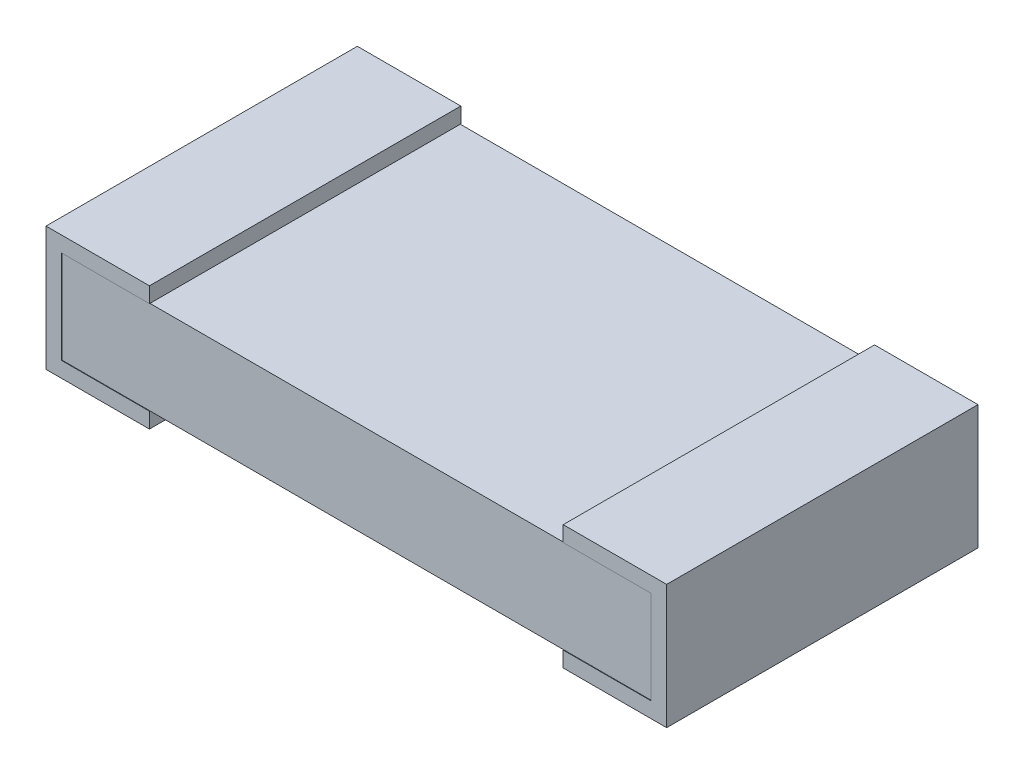
ISO-10303-21;
HEADER;
FILE_DESCRIPTION(('STEP AP214'),'2;1');
FILE_NAME('part.step','',(''),(''),'','','');
FILE_SCHEMA(('AUTOMOTIVE_DESIGN { 1 0 10303 214 1 1 1 1 }'));
ENDSEC;
DATA;
#1=APPLICATION_CONTEXT('core data for automotive mechanical design processes');
#2=APPLICATION_PROTOCOL_DEFINITION('international standard','automotive_design',2000,#1);
#3=PRODUCT_CONTEXT('',#1,'mechanical');
#4=PRODUCT('Part','Part','',(#3));
#5=PRODUCT_RELATED_PRODUCT_CATEGORY('part','',(#4));
#6=PRODUCT_DEFINITION_FORMATION('','',#4);
#7=PRODUCT_DEFINITION_CONTEXT('part definition',#1,'design');
#8=PRODUCT_DEFINITION('design','',#6,#7);
#9=PRODUCT_DEFINITION_SHAPE('','',#8);
#10=(LENGTH_UNIT() NAMED_UNIT(*) SI_UNIT(.MILLI.,.METRE.));
#11=(NAMED_UNIT(*) PLANE_ANGLE_UNIT() SI_UNIT($,.RADIAN.));
#12=(NAMED_UNIT(*) SI_UNIT($,.STERADIAN.) SOLID_ANGLE_UNIT());
#13=UNCERTAINTY_MEASURE_WITH_UNIT(LENGTH_MEASURE(1.E-05),#10,'distance_accuracy_value','');
#14=(GEOMETRIC_REPRESENTATION_CONTEXT(3) GLOBAL_UNCERTAINTY_ASSIGNED_CONTEXT((#13)) GLOBAL_UNIT_ASSIGNED_CONTEXT((#10,
#11,#12)) REPRESENTATION_CONTEXT('',''));
#15=CARTESIAN_POINT('',(0.,0.,0.));
#16=DIRECTION('',(0.,0.,1.));
#17=DIRECTION('',(1.,0.,0.));
#18=AXIS2_PLACEMENT_3D('',#15,#16,#17);
#19=CARTESIAN_POINT('',(2.9718,0.0762000000000004,-0.762));
#20=DIRECTION('',(0.,-1.,0.));
#21=DIRECTION('',(1.,0.,0.));
#22=AXIS2_PLACEMENT_3D('',#19,#20,#21);
#23=PLANE('',#22);
#24=DIRECTION('',(1.,0.,0.));
#25=VECTOR('',#24,1.);
#26=CARTESIAN_POINT('',(2.9718,0.0762000000000004,-0.762));
#27=LINE('',#26,#25);
#28=CARTESIAN_POINT('',(0.508,0.0762000000000001,-0.762));
#29=VERTEX_POINT('',#28);
#30=CARTESIAN_POINT('',(2.54,0.0762000000000001,-0.762));
#31=VERTEX_POINT('',#30);
#32=EDGE_CURVE('E41',#29,#31,#27,.T.);
#33=ORIENTED_EDGE('',*,*,#32,.T.);
#34=DIRECTION('',(0.,0.,-1.));
#35=VECTOR('',#34,1.);
#36=CARTESIAN_POINT('',(2.54,0.0762000000000001,0.76454));
#37=LINE('',#36,#35);
#38=CARTESIAN_POINT('',(2.54,0.0762000000000001,0.762));
#39=VERTEX_POINT('',#38);
#40=EDGE_CURVE('E272',#39,#31,#37,.T.);
#41=ORIENTED_EDGE('',*,*,#40,.F.);
#42=DIRECTION('',(1.,0.,0.));
#43=VECTOR('',#42,1.);
#44=CARTESIAN_POINT('',(2.9718,0.0762000000000004,0.762));
#45=LINE('',#44,#43);
#46=CARTESIAN_POINT('',(0.508,0.0762000000000001,0.762));
#47=VERTEX_POINT('',#46);
#48=EDGE_CURVE('E371',#47,#39,#45,.T.);
#49=ORIENTED_EDGE('',*,*,#48,.F.);
#50=DIRECTION('',(0.,0.,-1.));
#51=VECTOR('',#50,1.);
#52=CARTESIAN_POINT('',(0.508,0.0762000000000001,0.76454));
#53=LINE('',#52,#51);
#54=EDGE_CURVE('E333',#47,#29,#53,.T.);
#55=ORIENTED_EDGE('',*,*,#54,.T.);
#56=EDGE_LOOP('',(#33,#41,#49,#55));
#57=FACE_BOUND('',#56,.T.);
#58=ADVANCED_FACE('F32',(#57),#23,.T.);
#59=CARTESIAN_POINT('',(0.0762,0.5334,-0.762));
#60=DIRECTION('',(0.,1.,0.));
#61=DIRECTION('',(0.,0.,1.));
#62=AXIS2_PLACEMENT_3D('',#59,#60,#61);
#63=PLANE('',#62);
#64=DIRECTION('',(-1.,0.,0.));
#65=VECTOR('',#64,1.);
#66=CARTESIAN_POINT('',(0.0762,0.5334,0.762));
#67=LINE('',#66,#65);
#68=CARTESIAN_POINT('',(2.54,0.5334,0.762));
#69=VERTEX_POINT('',#68);
#70=CARTESIAN_POINT('',(0.508,0.5334,0.762));
#71=VERTEX_POINT('',#70);
#72=EDGE_CURVE('E364',#69,#71,#67,.T.);
#73=ORIENTED_EDGE('',*,*,#72,.F.);
#74=DIRECTION('',(0.,0.,-1.));
#75=VECTOR('',#74,1.);
#76=CARTESIAN_POINT('',(2.54,0.5334,0.76454));
#77=LINE('',#76,#75);
#78=CARTESIAN_POINT('',(2.54,0.5334,-0.762));
#79=VERTEX_POINT('',#78);
#80=EDGE_CURVE('E261',#69,#79,#77,.T.);
#81=ORIENTED_EDGE('',*,*,#80,.T.);
#82=DIRECTION('',(-1.,0.,0.));
#83=VECTOR('',#82,1.);
#84=CARTESIAN_POINT('',(0.0762,0.5334,-0.762));
#85=LINE('',#84,#83);
#86=CARTESIAN_POINT('',(0.508,0.5334,-0.762));
#87=VERTEX_POINT('',#86);
#88=EDGE_CURVE('E353',#79,#87,#85,.T.);
#89=ORIENTED_EDGE('',*,*,#88,.T.);
#90=DIRECTION('',(0.,0.,-1.));
#91=VECTOR('',#90,1.);
#92=CARTESIAN_POINT('',(0.508,0.5334,0.76454));
#93=LINE('',#92,#91);
#94=EDGE_CURVE('E344',#71,#87,#93,.T.);
#95=ORIENTED_EDGE('',*,*,#94,.F.);
#96=EDGE_LOOP('',(#73,#81,#89,#95));
#97=FACE_BOUND('',#96,.T.);
#98=ADVANCED_FACE('F34',(#97),#63,.T.);
#99=CARTESIAN_POINT('',(2.9718,0.5334,-0.762));
#100=DIRECTION('',(0.,0.,-1.));
#101=DIRECTION('',(-1.,0.,0.));
#102=AXIS2_PLACEMENT_3D('',#99,#100,#101);
#103=PLANE('',#102);
#104=DIRECTION('',(0.,1.,0.));
#105=VECTOR('',#104,1.);
#106=CARTESIAN_POINT('',(2.9718,0.0762000000000004,-0.762));
#107=LINE('',#106,#105);
#108=CARTESIAN_POINT('',(2.9718,0.0762,-0.762));
#109=VERTEX_POINT('',#108);
#110=CARTESIAN_POINT('',(2.9718,0.5334,-0.762));
#111=VERTEX_POINT('',#110);
#112=EDGE_CURVE('E351',#109,#111,#107,.T.);
#113=ORIENTED_EDGE('',*,*,#112,.F.);
#114=DIRECTION('',(-1.,0.,0.));
#115=VECTOR('',#114,1.);
#116=CARTESIAN_POINT('',(2.9718,0.0762,-0.762));
#117=LINE('',#116,#115);
#118=EDGE_CURVE('E254',#109,#31,#117,.T.);
#119=ORIENTED_EDGE('',*,*,#118,.T.);
#120=ORIENTED_EDGE('',*,*,#32,.F.);
#121=CARTESIAN_POINT('',(0.0762,0.0762,-0.762));
#122=VERTEX_POINT('',#121);
#123=EDGE_CURVE('E11',#122,#29,#27,.T.);
#124=ORIENTED_EDGE('',*,*,#123,.F.);
#125=DIRECTION('',(0.,-1.,0.));
#126=VECTOR('',#125,1.);
#127=CARTESIAN_POINT('',(0.0762,0.5334,-0.762));
#128=LINE('',#127,#126);
#129=CARTESIAN_POINT('',(0.0762,0.5334,-0.762));
#130=VERTEX_POINT('',#129);
#131=EDGE_CURVE('E356',#130,#122,#128,.T.);
#132=ORIENTED_EDGE('',*,*,#131,.F.);
#133=DIRECTION('',(-1.,0.,0.));
#134=VECTOR('',#133,1.);
#135=CARTESIAN_POINT('',(2.9718,0.5334,-0.762));
#136=LINE('',#135,#134);
#137=EDGE_CURVE('E327',#87,#130,#136,.T.);
#138=ORIENTED_EDGE('',*,*,#137,.F.);
#139=ORIENTED_EDGE('',*,*,#88,.F.);
#140=EDGE_CURVE('E354',#111,#79,#85,.T.);
#141=ORIENTED_EDGE('',*,*,#140,.F.);
#142=EDGE_LOOP('',(#113,#119,#120,#124,#132,#138,#139,#141));
#143=FACE_BOUND('',#142,.T.);
#144=ADVANCED_FACE('F435',(#143),#103,.T.);
#145=CARTESIAN_POINT('',(2.9718,0.5334,0.762));
#146=DIRECTION('',(0.,0.,-1.));
#147=DIRECTION('',(-1.,0.,0.));
#148=AXIS2_PLACEMENT_3D('',#145,#146,#147);
#149=PLANE('',#148);
#150=DIRECTION('',(0.,1.,0.));
#151=VECTOR('',#150,1.);
#152=CARTESIAN_POINT('',(2.9718,0.0762000000000004,0.762));
#153=LINE('',#152,#151);
#154=CARTESIAN_POINT('',(2.9718,0.0762000000000004,0.762));
#155=VERTEX_POINT('',#154);
#156=CARTESIAN_POINT('',(2.9718,0.5334,0.762));
#157=VERTEX_POINT('',#156);
#158=EDGE_CURVE('E350',#155,#157,#153,.T.);
#159=ORIENTED_EDGE('',*,*,#158,.T.);
#160=EDGE_CURVE('E361',#157,#69,#67,.T.);
#161=ORIENTED_EDGE('',*,*,#160,.T.);
#162=ORIENTED_EDGE('',*,*,#72,.T.);
#163=CARTESIAN_POINT('',(0.0762,0.5334,0.762));
#164=VERTEX_POINT('',#163);
#165=EDGE_CURVE('E360',#71,#164,#67,.T.);
#166=ORIENTED_EDGE('',*,*,#165,.T.);
#167=DIRECTION('',(0.,-1.,0.));
#168=VECTOR('',#167,1.);
#169=CARTESIAN_POINT('',(0.0762,0.5334,0.762));
#170=LINE('',#169,#168);
#171=CARTESIAN_POINT('',(0.0762,0.0762,0.762));
#172=VERTEX_POINT('',#171);
#173=EDGE_CURVE('E363',#164,#172,#170,.T.);
#174=ORIENTED_EDGE('',*,*,#173,.T.);
#175=EDGE_CURVE('E36',#172,#47,#45,.T.);
#176=ORIENTED_EDGE('',*,*,#175,.T.);
#177=ORIENTED_EDGE('',*,*,#48,.T.);
#178=EDGE_CURVE('E366',#39,#155,#45,.T.);
#179=ORIENTED_EDGE('',*,*,#178,.T.);
#180=EDGE_LOOP('',(#159,#161,#162,#166,#174,#176,#177,#179));
#181=FACE_BOUND('',#180,.T.);
#182=ADVANCED_FACE('F373',(#181),#149,.F.);
#183=CARTESIAN_POINT('',(0.0762,0.0762,0.76454));
#184=DIRECTION('',(0.,1.,0.));
#185=DIRECTION('',(-1.,0.,0.));
#186=AXIS2_PLACEMENT_3D('',#183,#184,#185);
#187=PLANE('',#186);
#188=ORIENTED_EDGE('',*,*,#175,.F.);
#189=DIRECTION('',(0.,0.,-1.));
#190=VECTOR('',#189,1.);
#191=CARTESIAN_POINT('',(0.0762,0.0762,0.76454));
#192=LINE('',#191,#190);
#193=CARTESIAN_POINT('',(0.0762,0.0762,0.76454));
#194=VERTEX_POINT('',#193);
#195=EDGE_CURVE('E335',#194,#172,#192,.T.);
#196=ORIENTED_EDGE('',*,*,#195,.F.);
#197=DIRECTION('',(1.,0.,0.));
#198=VECTOR('',#197,1.);
#199=CARTESIAN_POINT('',(0.0762,0.0762,0.76454));
#200=LINE('',#199,#198);
#201=CARTESIAN_POINT('',(0.508,0.0762000000000001,0.76454));
#202=VERTEX_POINT('',#201);
#203=EDGE_CURVE('E293',#194,#202,#200,.T.);
#204=ORIENTED_EDGE('',*,*,#203,.T.);
#205=EDGE_CURVE('E330',#202,#47,#53,.T.);
#206=ORIENTED_EDGE('',*,*,#205,.T.);
#207=EDGE_LOOP('',(#188,#196,#204,#206));
#208=FACE_BOUND('',#207,.T.);
#209=ADVANCED_FACE('F376',(#208),#187,.T.);
#210=CARTESIAN_POINT('',(0.0762,0.5334,0.76454));
#211=DIRECTION('',(1.,0.,0.));
#212=DIRECTION('',(0.,0.,-1.));
#213=AXIS2_PLACEMENT_3D('',#210,#211,#212);
#214=PLANE('',#213);
#215=ORIENTED_EDGE('',*,*,#173,.F.);
#216=DIRECTION('',(0.,0.,-1.));
#217=VECTOR('',#216,1.);
#218=CARTESIAN_POINT('',(0.0762,0.5334,0.76454));
#219=LINE('',#218,#217);
#220=CARTESIAN_POINT('',(0.0762,0.5334,0.76454));
#221=VERTEX_POINT('',#220);
#222=EDGE_CURVE('E57',#221,#164,#219,.T.);
#223=ORIENTED_EDGE('',*,*,#222,.F.);
#224=DIRECTION('',(0.,-1.,0.));
#225=VECTOR('',#224,1.);
#226=CARTESIAN_POINT('',(0.0762,0.5334,0.76454));
#227=LINE('',#226,#225);
#228=EDGE_CURVE('E290',#221,#194,#227,.T.);
#229=ORIENTED_EDGE('',*,*,#228,.T.);
#230=ORIENTED_EDGE('',*,*,#195,.T.);
#231=EDGE_LOOP('',(#215,#223,#229,#230));
#232=FACE_BOUND('',#231,.T.);
#233=ADVANCED_FACE('F379',(#232),#214,.T.);
#234=CARTESIAN_POINT('',(0.508,0.5334,0.76454));
#235=DIRECTION('',(0.,-1.,0.));
#236=DIRECTION('',(0.,0.,-1.));
#237=AXIS2_PLACEMENT_3D('',#234,#235,#236);
#238=PLANE('',#237);
#239=ORIENTED_EDGE('',*,*,#165,.F.);
#240=CARTESIAN_POINT('',(0.508,0.5334,0.76454));
#241=VERTEX_POINT('',#240);
#242=EDGE_CURVE('E341',#241,#71,#93,.T.);
#243=ORIENTED_EDGE('',*,*,#242,.F.);
#244=DIRECTION('',(-1.,0.,0.));
#245=VECTOR('',#244,1.);
#246=CARTESIAN_POINT('',(0.508,0.5334,0.76454));
#247=LINE('',#246,#245);
#248=EDGE_CURVE('E288',#241,#221,#247,.T.);
#249=ORIENTED_EDGE('',*,*,#248,.T.);
#250=ORIENTED_EDGE('',*,*,#222,.T.);
#251=EDGE_LOOP('',(#239,#243,#249,#250));
#252=FACE_BOUND('',#251,.T.);
#253=ADVANCED_FACE('F387',(#252),#238,.T.);
#254=CARTESIAN_POINT('',(0.,0.,0.76454));
#255=DIRECTION('',(-1.,0.,0.));
#256=DIRECTION('',(0.,0.,1.));
#257=AXIS2_PLACEMENT_3D('',#254,#255,#256);
#258=PLANE('',#257);
#259=DIRECTION('',(0.,1.,0.));
#260=VECTOR('',#259,1.);
#261=CARTESIAN_POINT('',(0.,0.,-0.76454));
#262=LINE('',#261,#260);
#263=CARTESIAN_POINT('',(0.,0.,-0.76454));
#264=VERTEX_POINT('',#263);
#265=CARTESIAN_POINT('',(0.,0.6096,-0.76454));
#266=VERTEX_POINT('',#265);
#267=EDGE_CURVE('E277',#264,#266,#262,.T.);
#268=ORIENTED_EDGE('',*,*,#267,.F.);
#269=DIRECTION('',(0.,0.,-1.));
#270=VECTOR('',#269,1.);
#271=CARTESIAN_POINT('',(0.,0.,0.76454));
#272=LINE('',#271,#270);
#273=CARTESIAN_POINT('',(0.,0.,0.76454));
#274=VERTEX_POINT('',#273);
#275=EDGE_CURVE('E325',#274,#264,#272,.T.);
#276=ORIENTED_EDGE('',*,*,#275,.F.);
#277=DIRECTION('',(0.,1.,0.));
#278=VECTOR('',#277,1.);
#279=CARTESIAN_POINT('',(0.,0.,0.76454));
#280=LINE('',#279,#278);
#281=CARTESIAN_POINT('',(0.,0.6096,0.76454));
#282=VERTEX_POINT('',#281);
#283=EDGE_CURVE('E278',#274,#282,#280,.T.);
#284=ORIENTED_EDGE('',*,*,#283,.T.);
#285=DIRECTION('',(0.,0.,-1.));
#286=VECTOR('',#285,1.);
#287=CARTESIAN_POINT('',(0.,0.6096,0.76454));
#288=LINE('',#287,#286);
#289=EDGE_CURVE('E302',#282,#266,#288,.T.);
#290=ORIENTED_EDGE('',*,*,#289,.T.);
#291=EDGE_LOOP('',(#268,#276,#284,#290));
#292=FACE_BOUND('',#291,.T.);
#293=ADVANCED_FACE('F413',(#292),#258,.T.);
#294=CARTESIAN_POINT('',(0.,0.,0.76454));
#295=DIRECTION('',(0.,-1.,0.));
#296=DIRECTION('',(1.,0.,0.));
#297=AXIS2_PLACEMENT_3D('',#294,#295,#296);
#298=PLANE('',#297);
#299=DIRECTION('',(-1.,0.,0.));
#300=VECTOR('',#299,1.);
#301=CARTESIAN_POINT('',(0.,0.,-0.76454));
#302=LINE('',#301,#300);
#303=CARTESIAN_POINT('',(0.508,0.,-0.76454));
#304=VERTEX_POINT('',#303);
#305=EDGE_CURVE('E282',#304,#264,#302,.T.);
#306=ORIENTED_EDGE('',*,*,#305,.F.);
#307=DIRECTION('',(0.,0.,-1.));
#308=VECTOR('',#307,1.);
#309=CARTESIAN_POINT('',(0.508,0.,0.76454));
#310=LINE('',#309,#308);
#311=CARTESIAN_POINT('',(0.508,0.,0.76454));
#312=VERTEX_POINT('',#311);
#313=EDGE_CURVE('E328',#312,#304,#310,.T.);
#314=ORIENTED_EDGE('',*,*,#313,.F.);
#315=DIRECTION('',(-1.,0.,0.));
#316=VECTOR('',#315,1.);
#317=CARTESIAN_POINT('',(0.,0.,0.76454));
#318=LINE('',#317,#316);
#319=EDGE_CURVE('E299',#312,#274,#318,.T.);
#320=ORIENTED_EDGE('',*,*,#319,.T.);
#321=ORIENTED_EDGE('',*,*,#275,.T.);
#322=EDGE_LOOP('',(#306,#314,#320,#321));
#323=FACE_BOUND('',#322,.T.);
#324=ADVANCED_FACE('F416',(#323),#298,.T.);
#325=CARTESIAN_POINT('',(0.508,0.,0.76454));
#326=DIRECTION('',(1.,0.,0.));
#327=DIRECTION('',(0.,0.,-1.));
#328=AXIS2_PLACEMENT_3D('',#325,#326,#327);
#329=PLANE('',#328);
#330=DIRECTION('',(0.,-1.,0.));
#331=VECTOR('',#330,1.);
#332=CARTESIAN_POINT('',(0.508,0.,-0.76454));
#333=LINE('',#332,#331);
#334=CARTESIAN_POINT('',(0.508,0.0762000000000001,-0.76454));
#335=VERTEX_POINT('',#334);
#336=EDGE_CURVE('E320',#335,#304,#333,.T.);
#337=ORIENTED_EDGE('',*,*,#336,.F.);
#338=EDGE_CURVE('E334',#29,#335,#53,.T.);
#339=ORIENTED_EDGE('',*,*,#338,.F.);
#340=ORIENTED_EDGE('',*,*,#54,.F.);
#341=ORIENTED_EDGE('',*,*,#205,.F.);
#342=DIRECTION('',(0.,-1.,0.));
#343=VECTOR('',#342,1.);
#344=CARTESIAN_POINT('',(0.508,0.,0.76454));
#345=LINE('',#344,#343);
#346=EDGE_CURVE('E296',#202,#312,#345,.T.);
#347=ORIENTED_EDGE('',*,*,#346,.T.);
#348=ORIENTED_EDGE('',*,*,#313,.T.);
#349=EDGE_LOOP('',(#337,#339,#340,#341,#347,#348));
#350=FACE_BOUND('',#349,.T.);
#351=ADVANCED_FACE('F419',(#350),#329,.T.);
#352=CARTESIAN_POINT('',(0.0762,0.0762,-0.76454));
#353=VERTEX_POINT('',#352);
#354=EDGE_CURVE('E338',#122,#353,#192,.T.);
#355=ORIENTED_EDGE('',*,*,#354,.F.);
#356=ORIENTED_EDGE('',*,*,#123,.T.);
#357=ORIENTED_EDGE('',*,*,#338,.T.);
#358=DIRECTION('',(1.,0.,0.));
#359=VECTOR('',#358,1.);
#360=CARTESIAN_POINT('',(0.0762,0.0762,-0.76454));
#361=LINE('',#360,#359);
#362=EDGE_CURVE('E317',#353,#335,#361,.T.);
#363=ORIENTED_EDGE('',*,*,#362,.F.);
#364=EDGE_LOOP('',(#355,#356,#357,#363));
#365=FACE_BOUND('',#364,.T.);
#366=ADVANCED_FACE('F428',(#365),#187,.T.);
#367=CARTESIAN_POINT('',(0.0762,0.5334,-0.76454));
#368=VERTEX_POINT('',#367);
#369=EDGE_CURVE('E340',#130,#368,#219,.T.);
#370=ORIENTED_EDGE('',*,*,#369,.F.);
#371=ORIENTED_EDGE('',*,*,#131,.T.);
#372=ORIENTED_EDGE('',*,*,#354,.T.);
#373=DIRECTION('',(0.,-1.,0.));
#374=VECTOR('',#373,1.);
#375=CARTESIAN_POINT('',(0.0762,0.5334,-0.76454));
#376=LINE('',#375,#374);
#377=EDGE_CURVE('E314',#368,#353,#376,.T.);
#378=ORIENTED_EDGE('',*,*,#377,.F.);
#379=EDGE_LOOP('',(#370,#371,#372,#378));
#380=FACE_BOUND('',#379,.T.);
#381=ADVANCED_FACE('F431',(#380),#214,.T.);
#382=CARTESIAN_POINT('',(0.508,0.5334,-0.76454));
#383=VERTEX_POINT('',#382);
#384=EDGE_CURVE('E345',#87,#383,#93,.T.);
#385=ORIENTED_EDGE('',*,*,#384,.F.);
#386=ORIENTED_EDGE('',*,*,#137,.T.);
#387=ORIENTED_EDGE('',*,*,#369,.T.);
#388=DIRECTION('',(-1.,0.,0.));
#389=VECTOR('',#388,1.);
#390=CARTESIAN_POINT('',(0.508,0.5334,-0.76454));
#391=LINE('',#390,#389);
#392=EDGE_CURVE('E311',#383,#368,#391,.T.);
#393=ORIENTED_EDGE('',*,*,#392,.F.);
#394=EDGE_LOOP('',(#385,#386,#387,#393));
#395=FACE_BOUND('',#394,.T.);
#396=ADVANCED_FACE('F401',(#395),#238,.T.);
#397=CARTESIAN_POINT('',(0.508,0.6096,0.76454));
#398=DIRECTION('',(1.,0.,0.));
#399=DIRECTION('',(0.,1.,0.));
#400=AXIS2_PLACEMENT_3D('',#397,#398,#399);
#401=PLANE('',#400);
#402=DIRECTION('',(0.,-1.,0.));
#403=VECTOR('',#402,1.);
#404=CARTESIAN_POINT('',(0.508,0.6096,-0.76454));
#405=LINE('',#404,#403);
#406=CARTESIAN_POINT('',(0.508,0.6096,-0.76454));
#407=VERTEX_POINT('',#406);
#408=EDGE_CURVE('E308',#407,#383,#405,.T.);
#409=ORIENTED_EDGE('',*,*,#408,.F.);
#410=DIRECTION('',(0.,0.,-1.));
#411=VECTOR('',#410,1.);
#412=CARTESIAN_POINT('',(0.508,0.6096,0.76454));
#413=LINE('',#412,#411);
#414=CARTESIAN_POINT('',(0.508,0.6096,0.76454));
#415=VERTEX_POINT('',#414);
#416=EDGE_CURVE('E346',#415,#407,#413,.T.);
#417=ORIENTED_EDGE('',*,*,#416,.F.);
#418=DIRECTION('',(0.,-1.,0.));
#419=VECTOR('',#418,1.);
#420=CARTESIAN_POINT('',(0.508,0.6096,0.76454));
#421=LINE('',#420,#419);
#422=EDGE_CURVE('E285',#415,#241,#421,.T.);
#423=ORIENTED_EDGE('',*,*,#422,.T.);
#424=ORIENTED_EDGE('',*,*,#242,.T.);
#425=ORIENTED_EDGE('',*,*,#94,.T.);
#426=ORIENTED_EDGE('',*,*,#384,.T.);
#427=EDGE_LOOP('',(#409,#417,#423,#424,#425,#426));
#428=FACE_BOUND('',#427,.T.);
#429=ADVANCED_FACE('F392',(#428),#401,.T.);
#430=CARTESIAN_POINT('',(0.,0.6096,0.76454));
#431=DIRECTION('',(0.,1.,0.));
#432=DIRECTION('',(0.,0.,1.));
#433=AXIS2_PLACEMENT_3D('',#430,#431,#432);
#434=PLANE('',#433);
#435=DIRECTION('',(1.,0.,0.));
#436=VECTOR('',#435,1.);
#437=CARTESIAN_POINT('',(0.,0.6096,-0.76454));
#438=LINE('',#437,#436);
#439=EDGE_CURVE('E305',#266,#407,#438,.T.);
#440=ORIENTED_EDGE('',*,*,#439,.F.);
#441=ORIENTED_EDGE('',*,*,#289,.F.);
#442=DIRECTION('',(1.,0.,0.));
#443=VECTOR('',#442,1.);
#444=CARTESIAN_POINT('',(0.,0.6096,0.76454));
#445=LINE('',#444,#443);
#446=EDGE_CURVE('E281',#282,#415,#445,.T.);
#447=ORIENTED_EDGE('',*,*,#446,.T.);
#448=ORIENTED_EDGE('',*,*,#416,.T.);
#449=EDGE_LOOP('',(#440,#441,#447,#448));
#450=FACE_BOUND('',#449,.T.);
#451=ADVANCED_FACE('F409',(#450),#434,.T.);
#452=CARTESIAN_POINT('',(0.,0.6096,0.76454));
#453=DIRECTION('',(0.,0.,-1.));
#454=DIRECTION('',(-1.,0.,0.));
#455=AXIS2_PLACEMENT_3D('',#452,#453,#454);
#456=PLANE('',#455);
#457=ORIENTED_EDGE('',*,*,#283,.F.);
#458=ORIENTED_EDGE('',*,*,#319,.F.);
#459=ORIENTED_EDGE('',*,*,#346,.F.);
#460=ORIENTED_EDGE('',*,*,#203,.F.);
#461=ORIENTED_EDGE('',*,*,#228,.F.);
#462=ORIENTED_EDGE('',*,*,#248,.F.);
#463=ORIENTED_EDGE('',*,*,#422,.F.);
#464=ORIENTED_EDGE('',*,*,#446,.F.);
#465=EDGE_LOOP('',(#457,#458,#459,#460,#461,#462,#463,#464));
#466=FACE_BOUND('',#465,.T.);
#467=ADVANCED_FACE('F384',(#466),#456,.F.);
#468=CARTESIAN_POINT('',(0.,0.6096,-0.76454));
#469=DIRECTION('',(0.,0.,-1.));
#470=DIRECTION('',(-1.,0.,0.));
#471=AXIS2_PLACEMENT_3D('',#468,#469,#470);
#472=PLANE('',#471);
#473=ORIENTED_EDGE('',*,*,#267,.T.);
#474=ORIENTED_EDGE('',*,*,#439,.T.);
#475=ORIENTED_EDGE('',*,*,#408,.T.);
#476=ORIENTED_EDGE('',*,*,#392,.T.);
#477=ORIENTED_EDGE('',*,*,#377,.T.);
#478=ORIENTED_EDGE('',*,*,#362,.T.);
#479=ORIENTED_EDGE('',*,*,#336,.T.);
#480=ORIENTED_EDGE('',*,*,#305,.T.);
#481=EDGE_LOOP('',(#473,#474,#475,#476,#477,#478,#479,#480));
#482=FACE_BOUND('',#481,.T.);
#483=ADVANCED_FACE('F405',(#482),#472,.T.);
#484=CARTESIAN_POINT('',(2.54,0.5334,0.76454));
#485=DIRECTION('',(0.,1.,0.));
#486=DIRECTION('',(0.,0.,1.));
#487=AXIS2_PLACEMENT_3D('',#484,#485,#486);
#488=PLANE('',#487);
#489=CARTESIAN_POINT('',(2.54,0.5334,0.76454));
#490=VERTEX_POINT('',#489);
#491=EDGE_CURVE('E258',#490,#69,#77,.T.);
#492=ORIENTED_EDGE('',*,*,#491,.T.);
#493=ORIENTED_EDGE('',*,*,#160,.F.);
#494=DIRECTION('',(0.,0.,-1.));
#495=VECTOR('',#494,1.);
#496=CARTESIAN_POINT('',(2.9718,0.5334,0.76454));
#497=LINE('',#496,#495);
#498=CARTESIAN_POINT('',(2.9718,0.5334,0.76454));
#499=VERTEX_POINT('',#498);
#500=EDGE_CURVE('E263',#499,#157,#497,.T.);
#501=ORIENTED_EDGE('',*,*,#500,.F.);
#502=DIRECTION('',(1.,0.,0.));
#503=VECTOR('',#502,1.);
#504=CARTESIAN_POINT('',(2.54,0.5334,0.76454));
#505=LINE('',#504,#503);
#506=EDGE_CURVE('E232',#490,#499,#505,.T.);
#507=ORIENTED_EDGE('',*,*,#506,.F.);
#508=EDGE_LOOP('',(#492,#493,#501,#507));
#509=FACE_BOUND('',#508,.T.);
#510=ADVANCED_FACE('F461',(#509),#488,.F.);
#511=CARTESIAN_POINT('',(2.9718,0.5334,0.76454));
#512=DIRECTION('',(1.,0.,0.));
#513=DIRECTION('',(0.,0.,-1.));
#514=AXIS2_PLACEMENT_3D('',#511,#512,#513);
#515=PLANE('',#514);
#516=ORIENTED_EDGE('',*,*,#500,.T.);
#517=ORIENTED_EDGE('',*,*,#158,.F.);
#518=DIRECTION('',(0.,0.,-1.));
#519=VECTOR('',#518,1.);
#520=CARTESIAN_POINT('',(2.9718,0.0762,0.76454));
#521=LINE('',#520,#519);
#522=CARTESIAN_POINT('',(2.9718,0.0762,0.76454));
#523=VERTEX_POINT('',#522);
#524=EDGE_CURVE('E49',#523,#155,#521,.T.);
#525=ORIENTED_EDGE('',*,*,#524,.F.);
#526=DIRECTION('',(0.,-1.,0.));
#527=VECTOR('',#526,1.);
#528=CARTESIAN_POINT('',(2.9718,0.5334,0.76454));
#529=LINE('',#528,#527);
#530=EDGE_CURVE('E230',#499,#523,#529,.T.);
#531=ORIENTED_EDGE('',*,*,#530,.F.);
#532=EDGE_LOOP('',(#516,#517,#525,#531));
#533=FACE_BOUND('',#532,.T.);
#534=ADVANCED_FACE('F464',(#533),#515,.F.);
#535=CARTESIAN_POINT('',(2.9718,0.0762,0.76454));
#536=DIRECTION('',(0.,-1.,0.));
#537=DIRECTION('',(1.,0.,0.));
#538=AXIS2_PLACEMENT_3D('',#535,#536,#537);
#539=PLANE('',#538);
#540=ORIENTED_EDGE('',*,*,#524,.T.);
#541=ORIENTED_EDGE('',*,*,#178,.F.);
#542=CARTESIAN_POINT('',(2.54,0.0762000000000001,0.76454));
#543=VERTEX_POINT('',#542);
#544=EDGE_CURVE('E269',#543,#39,#37,.T.);
#545=ORIENTED_EDGE('',*,*,#544,.F.);
#546=DIRECTION('',(-1.,0.,0.));
#547=VECTOR('',#546,1.);
#548=CARTESIAN_POINT('',(2.9718,0.0762,0.76454));
#549=LINE('',#548,#547);
#550=EDGE_CURVE('E228',#523,#543,#549,.T.);
#551=ORIENTED_EDGE('',*,*,#550,.F.);
#552=EDGE_LOOP('',(#540,#541,#545,#551));
#553=FACE_BOUND('',#552,.T.);
#554=ADVANCED_FACE('F466',(#553),#539,.F.);
#555=CARTESIAN_POINT('',(3.048,0.,0.76454));
#556=DIRECTION('',(-1.,0.,0.));
#557=DIRECTION('',(0.,0.,1.));
#558=AXIS2_PLACEMENT_3D('',#555,#556,#557);
#559=PLANE('',#558);
#560=DIRECTION('',(0.,1.,0.));
#561=VECTOR('',#560,1.);
#562=CARTESIAN_POINT('',(3.048,0.,-0.76454));
#563=LINE('',#562,#561);
#564=CARTESIAN_POINT('',(3.048,0.,-0.76454));
#565=VERTEX_POINT('',#564);
#566=CARTESIAN_POINT('',(3.048,0.6096,-0.76454));
#567=VERTEX_POINT('',#566);
#568=EDGE_CURVE('E237',#565,#567,#563,.T.);
#569=ORIENTED_EDGE('',*,*,#568,.T.);
#570=DIRECTION('',(0.,0.,-1.));
#571=VECTOR('',#570,1.);
#572=CARTESIAN_POINT('',(3.048,0.6096,0.76454));
#573=LINE('',#572,#571);
#574=CARTESIAN_POINT('',(3.048,0.6096,0.76454));
#575=VERTEX_POINT('',#574);
#576=EDGE_CURVE('E221',#575,#567,#573,.T.);
#577=ORIENTED_EDGE('',*,*,#576,.F.);
#578=DIRECTION('',(0.,1.,0.));
#579=VECTOR('',#578,1.);
#580=CARTESIAN_POINT('',(3.048,0.,0.76454));
#581=LINE('',#580,#579);
#582=CARTESIAN_POINT('',(3.048,0.,0.76454));
#583=VERTEX_POINT('',#582);
#584=EDGE_CURVE('E200',#583,#575,#581,.T.);
#585=ORIENTED_EDGE('',*,*,#584,.F.);
#586=DIRECTION('',(0.,0.,-1.));
#587=VECTOR('',#586,1.);
#588=CARTESIAN_POINT('',(3.048,0.,0.76454));
#589=LINE('',#588,#587);
#590=EDGE_CURVE('E209',#583,#565,#589,.T.);
#591=ORIENTED_EDGE('',*,*,#590,.T.);
#592=EDGE_LOOP('',(#569,#577,#585,#591));
#593=FACE_BOUND('',#592,.T.);
#594=ADVANCED_FACE('F219',(#593),#559,.F.);
#595=CARTESIAN_POINT('',(3.048,0.6096,0.76454));
#596=DIRECTION('',(0.,-1.,0.));
#597=DIRECTION('',(0.,0.,-1.));
#598=AXIS2_PLACEMENT_3D('',#595,#596,#597);
#599=PLANE('',#598);
#600=DIRECTION('',(-1.,0.,0.));
#601=VECTOR('',#600,1.);
#602=CARTESIAN_POINT('',(3.048,0.6096,-0.76454));
#603=LINE('',#602,#601);
#604=CARTESIAN_POINT('',(2.54,0.6096,-0.76454));
#605=VERTEX_POINT('',#604);
#606=EDGE_CURVE('E222',#567,#605,#603,.T.);
#607=ORIENTED_EDGE('',*,*,#606,.T.);
#608=DIRECTION('',(0.,0.,-1.));
#609=VECTOR('',#608,1.);
#610=CARTESIAN_POINT('',(2.54,0.6096,0.76454));
#611=LINE('',#610,#609);
#612=CARTESIAN_POINT('',(2.54,0.6096,0.76454));
#613=VERTEX_POINT('',#612);
#614=EDGE_CURVE('E255',#613,#605,#611,.T.);
#615=ORIENTED_EDGE('',*,*,#614,.F.);
#616=DIRECTION('',(-1.,0.,0.));
#617=VECTOR('',#616,1.);
#618=CARTESIAN_POINT('',(3.048,0.6096,0.76454));
#619=LINE('',#618,#617);
#620=EDGE_CURVE('E217',#575,#613,#619,.T.);
#621=ORIENTED_EDGE('',*,*,#620,.F.);
#622=ORIENTED_EDGE('',*,*,#576,.T.);
#623=EDGE_LOOP('',(#607,#615,#621,#622));
#624=FACE_BOUND('',#623,.T.);
#625=ADVANCED_FACE('F452',(#624),#599,.F.);
#626=CARTESIAN_POINT('',(2.54,0.6096,0.76454));
#627=DIRECTION('',(1.,0.,0.));
#628=DIRECTION('',(0.,1.,0.));
#629=AXIS2_PLACEMENT_3D('',#626,#627,#628);
#630=PLANE('',#629);
#631=DIRECTION('',(0.,-1.,0.));
#632=VECTOR('',#631,1.);
#633=CARTESIAN_POINT('',(2.54,0.6096,-0.76454));
#634=LINE('',#633,#632);
#635=CARTESIAN_POINT('',(2.54,0.5334,-0.76454));
#636=VERTEX_POINT('',#635);
#637=EDGE_CURVE('E224',#605,#636,#634,.T.);
#638=ORIENTED_EDGE('',*,*,#637,.T.);
#639=EDGE_CURVE('E262',#79,#636,#77,.T.);
#640=ORIENTED_EDGE('',*,*,#639,.F.);
#641=ORIENTED_EDGE('',*,*,#80,.F.);
#642=ORIENTED_EDGE('',*,*,#491,.F.);
#643=DIRECTION('',(0.,-1.,0.));
#644=VECTOR('',#643,1.);
#645=CARTESIAN_POINT('',(2.54,0.6096,0.76454));
#646=LINE('',#645,#644);
#647=EDGE_CURVE('E234',#613,#490,#646,.T.);
#648=ORIENTED_EDGE('',*,*,#647,.F.);
#649=ORIENTED_EDGE('',*,*,#614,.T.);
#650=EDGE_LOOP('',(#638,#640,#641,#642,#648,#649));
#651=FACE_BOUND('',#650,.T.);
#652=ADVANCED_FACE('F458',(#651),#630,.F.);
#653=ORIENTED_EDGE('',*,*,#140,.T.);
#654=ORIENTED_EDGE('',*,*,#639,.T.);
#655=DIRECTION('',(1.,0.,0.));
#656=VECTOR('',#655,1.);
#657=CARTESIAN_POINT('',(2.54,0.5334,-0.76454));
#658=LINE('',#657,#656);
#659=CARTESIAN_POINT('',(2.9718,0.5334,-0.76454));
#660=VERTEX_POINT('',#659);
#661=EDGE_CURVE('E248',#636,#660,#658,.T.);
#662=ORIENTED_EDGE('',*,*,#661,.T.);
#663=EDGE_CURVE('E266',#111,#660,#497,.T.);
#664=ORIENTED_EDGE('',*,*,#663,.F.);
#665=EDGE_LOOP('',(#653,#654,#662,#664));
#666=FACE_BOUND('',#665,.T.);
#667=ADVANCED_FACE('F549',(#666),#488,.F.);
#668=ORIENTED_EDGE('',*,*,#112,.T.);
#669=ORIENTED_EDGE('',*,*,#663,.T.);
#670=DIRECTION('',(0.,-1.,0.));
#671=VECTOR('',#670,1.);
#672=CARTESIAN_POINT('',(2.9718,0.5334,-0.76454));
#673=LINE('',#672,#671);
#674=CARTESIAN_POINT('',(2.9718,0.0762,-0.76454));
#675=VERTEX_POINT('',#674);
#676=EDGE_CURVE('E245',#660,#675,#673,.T.);
#677=ORIENTED_EDGE('',*,*,#676,.T.);
#678=EDGE_CURVE('E268',#109,#675,#521,.T.);
#679=ORIENTED_EDGE('',*,*,#678,.F.);
#680=EDGE_LOOP('',(#668,#669,#677,#679));
#681=FACE_BOUND('',#680,.T.);
#682=ADVANCED_FACE('F475',(#681),#515,.F.);
#683=ORIENTED_EDGE('',*,*,#118,.F.);
#684=ORIENTED_EDGE('',*,*,#678,.T.);
#685=DIRECTION('',(-1.,0.,0.));
#686=VECTOR('',#685,1.);
#687=CARTESIAN_POINT('',(2.9718,0.0762,-0.76454));
#688=LINE('',#687,#686);
#689=CARTESIAN_POINT('',(2.54,0.0762000000000001,-0.76454));
#690=VERTEX_POINT('',#689);
#691=EDGE_CURVE('E242',#675,#690,#688,.T.);
#692=ORIENTED_EDGE('',*,*,#691,.T.);
#693=EDGE_CURVE('E273',#31,#690,#37,.T.);
#694=ORIENTED_EDGE('',*,*,#693,.F.);
#695=EDGE_LOOP('',(#683,#684,#692,#694));
#696=FACE_BOUND('',#695,.T.);
#697=ADVANCED_FACE('F443',(#696),#539,.F.);
#698=CARTESIAN_POINT('',(2.54,0.,0.76454));
#699=DIRECTION('',(1.,0.,0.));
#700=DIRECTION('',(0.,0.,-1.));
#701=AXIS2_PLACEMENT_3D('',#698,#699,#700);
#702=PLANE('',#701);
#703=DIRECTION('',(0.,-1.,0.));
#704=VECTOR('',#703,1.);
#705=CARTESIAN_POINT('',(2.54,0.,-0.76454));
#706=LINE('',#705,#704);
#707=CARTESIAN_POINT('',(2.54,0.,-0.76454));
#708=VERTEX_POINT('',#707);
#709=EDGE_CURVE('E240',#690,#708,#706,.T.);
#710=ORIENTED_EDGE('',*,*,#709,.T.);
#711=DIRECTION('',(0.,0.,-1.));
#712=VECTOR('',#711,1.);
#713=CARTESIAN_POINT('',(2.54,0.,0.76454));
#714=LINE('',#713,#712);
#715=CARTESIAN_POINT('',(2.54,0.,0.76454));
#716=VERTEX_POINT('',#715);
#717=EDGE_CURVE('E216',#716,#708,#714,.T.);
#718=ORIENTED_EDGE('',*,*,#717,.F.);
#719=DIRECTION('',(0.,-1.,0.));
#720=VECTOR('',#719,1.);
#721=CARTESIAN_POINT('',(2.54,0.,0.76454));
#722=LINE('',#721,#720);
#723=EDGE_CURVE('E203',#543,#716,#722,.T.);
#724=ORIENTED_EDGE('',*,*,#723,.F.);
#725=ORIENTED_EDGE('',*,*,#544,.T.);
#726=ORIENTED_EDGE('',*,*,#40,.T.);
#727=ORIENTED_EDGE('',*,*,#693,.T.);
#728=EDGE_LOOP('',(#710,#718,#724,#725,#726,#727));
#729=FACE_BOUND('',#728,.T.);
#730=ADVANCED_FACE('F439',(#729),#702,.F.);
#731=CARTESIAN_POINT('',(3.048,0.,0.76454));
#732=DIRECTION('',(0.,1.,0.));
#733=DIRECTION('',(-1.,0.,0.));
#734=AXIS2_PLACEMENT_3D('',#731,#732,#733);
#735=PLANE('',#734);
#736=DIRECTION('',(1.,0.,0.));
#737=VECTOR('',#736,1.);
#738=CARTESIAN_POINT('',(3.048,0.,-0.76454));
#739=LINE('',#738,#737);
#740=EDGE_CURVE('E212',#708,#565,#739,.T.);
#741=ORIENTED_EDGE('',*,*,#740,.T.);
#742=ORIENTED_EDGE('',*,*,#590,.F.);
#743=DIRECTION('',(1.,0.,0.));
#744=VECTOR('',#743,1.);
#745=CARTESIAN_POINT('',(3.048,0.,0.76454));
#746=LINE('',#745,#744);
#747=EDGE_CURVE('E196',#716,#583,#746,.T.);
#748=ORIENTED_EDGE('',*,*,#747,.F.);
#749=ORIENTED_EDGE('',*,*,#717,.T.);
#750=EDGE_LOOP('',(#741,#742,#748,#749));
#751=FACE_BOUND('',#750,.T.);
#752=ADVANCED_FACE('F210',(#751),#735,.F.);
#753=CARTESIAN_POINT('',(3.048,0.6096,0.76454));
#754=DIRECTION('',(0.,0.,-1.));
#755=DIRECTION('',(1.,0.,0.));
#756=AXIS2_PLACEMENT_3D('',#753,#754,#755);
#757=PLANE('',#756);
#758=ORIENTED_EDGE('',*,*,#584,.T.);
#759=ORIENTED_EDGE('',*,*,#620,.T.);
#760=ORIENTED_EDGE('',*,*,#647,.T.);
#761=ORIENTED_EDGE('',*,*,#506,.T.);
#762=ORIENTED_EDGE('',*,*,#530,.T.);
#763=ORIENTED_EDGE('',*,*,#550,.T.);
#764=ORIENTED_EDGE('',*,*,#723,.T.);
#765=ORIENTED_EDGE('',*,*,#747,.T.);
#766=EDGE_LOOP('',(#758,#759,#760,#761,#762,#763,#764,#765));
#767=FACE_BOUND('',#766,.T.);
#768=ADVANCED_FACE('F198',(#767),#757,.F.);
#769=CARTESIAN_POINT('',(3.048,0.6096,-0.76454));
#770=DIRECTION('',(0.,0.,-1.));
#771=DIRECTION('',(1.,0.,0.));
#772=AXIS2_PLACEMENT_3D('',#769,#770,#771);
#773=PLANE('',#772);
#774=ORIENTED_EDGE('',*,*,#568,.F.);
#775=ORIENTED_EDGE('',*,*,#740,.F.);
#776=ORIENTED_EDGE('',*,*,#709,.F.);
#777=ORIENTED_EDGE('',*,*,#691,.F.);
#778=ORIENTED_EDGE('',*,*,#676,.F.);
#779=ORIENTED_EDGE('',*,*,#661,.F.);
#780=ORIENTED_EDGE('',*,*,#637,.F.);
#781=ORIENTED_EDGE('',*,*,#606,.F.);
#782=EDGE_LOOP('',(#774,#775,#776,#777,#778,#779,#780,#781));
#783=FACE_BOUND('',#782,.T.);
#784=ADVANCED_FACE('F447',(#783),#773,.T.);
#785=CLOSED_SHELL('',(#58,#98,#144,#182,#209,#233,#253,#293,#324,#351,#366,#381,#396,#429,#451,
#467,#483,#510,#534,#554,#594,#625,#652,#667,#682,#697,#730,#752,#768,#784));
#786=MANIFOLD_SOLID_BREP('B2',#785);
#787=ADVANCED_BREP_SHAPE_REPRESENTATION('',(#18,#786),#14);
#788=SHAPE_DEFINITION_REPRESENTATION(#9,#787);
ENDSEC;
END-ISO-10303-21;
